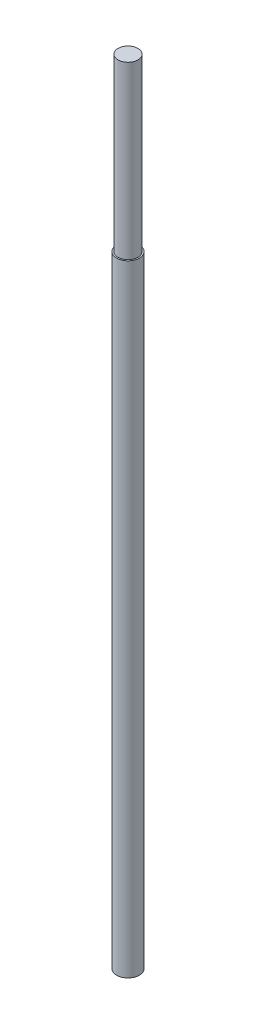
ISO-10303-21;
HEADER;
FILE_DESCRIPTION(('STEP AP214'),'2;1');
FILE_NAME('part.step','',(''),(''),'','','');
FILE_SCHEMA(('AUTOMOTIVE_DESIGN { 1 0 10303 214 1 1 1 1 }'));
ENDSEC;
DATA;
#1=APPLICATION_CONTEXT('core data for automotive mechanical design processes');
#2=APPLICATION_PROTOCOL_DEFINITION('international standard','automotive_design',2000,#1);
#3=PRODUCT_CONTEXT('',#1,'mechanical');
#4=PRODUCT('Part','Part','',(#3));
#5=PRODUCT_RELATED_PRODUCT_CATEGORY('part','',(#4));
#6=PRODUCT_DEFINITION_FORMATION('','',#4);
#7=PRODUCT_DEFINITION_CONTEXT('part definition',#1,'design');
#8=PRODUCT_DEFINITION('design','',#6,#7);
#9=PRODUCT_DEFINITION_SHAPE('','',#8);
#10=(LENGTH_UNIT() NAMED_UNIT(*) SI_UNIT(.MILLI.,.METRE.));
#11=(NAMED_UNIT(*) PLANE_ANGLE_UNIT() SI_UNIT($,.RADIAN.));
#12=(NAMED_UNIT(*) SI_UNIT($,.STERADIAN.) SOLID_ANGLE_UNIT());
#13=UNCERTAINTY_MEASURE_WITH_UNIT(LENGTH_MEASURE(1.E-05),#10,'distance_accuracy_value','');
#14=(GEOMETRIC_REPRESENTATION_CONTEXT(3) GLOBAL_UNCERTAINTY_ASSIGNED_CONTEXT((#13)) GLOBAL_UNIT_ASSIGNED_CONTEXT((#10,
#11,#12)) REPRESENTATION_CONTEXT('',''));
#15=CARTESIAN_POINT('',(0.,0.,0.));
#16=DIRECTION('',(0.,0.,1.));
#17=DIRECTION('',(1.,0.,0.));
#18=AXIS2_PLACEMENT_3D('',#15,#16,#17);
#19=CARTESIAN_POINT('',(0.,218.,0.));
#20=DIRECTION('',(0.,-1.,0.));
#21=DIRECTION('',(0.,0.,-1.));
#22=AXIS2_PLACEMENT_3D('',#19,#20,#21);
#23=CYLINDRICAL_SURFACE('',#22,4.);
#24=CARTESIAN_POINT('',(0.,218.,0.));
#25=DIRECTION('',(0.,1.,0.));
#26=DIRECTION('',(0.,0.,1.));
#27=AXIS2_PLACEMENT_3D('',#24,#25,#26);
#28=CIRCLE('',#27,4.);
#29=CARTESIAN_POINT('',(0.,218.,4.));
#30=VERTEX_POINT('',#29);
#31=EDGE_CURVE('E38',#30,#30,#28,.T.);
#32=ORIENTED_EDGE('',*,*,#31,.F.);
#33=EDGE_LOOP('',(#32));
#34=FACE_BOUND('',#33,.T.);
#35=CARTESIAN_POINT('',(0.,0.,0.));
#36=DIRECTION('',(0.,1.,0.));
#37=DIRECTION('',(0.,0.,1.));
#38=AXIS2_PLACEMENT_3D('',#35,#36,#37);
#39=CIRCLE('',#38,4.);
#40=CARTESIAN_POINT('',(0.,0.,4.));
#41=VERTEX_POINT('',#40);
#42=EDGE_CURVE('E34',#41,#41,#39,.T.);
#43=ORIENTED_EDGE('',*,*,#42,.T.);
#44=EDGE_LOOP('',(#43));
#45=FACE_BOUND('',#44,.T.);
#46=ADVANCED_FACE('F31',(#34,#45),#23,.T.);
#47=CARTESIAN_POINT('',(0.,218.,0.));
#48=DIRECTION('',(0.,1.,0.));
#49=DIRECTION('',(0.,0.,1.));
#50=AXIS2_PLACEMENT_3D('',#47,#48,#49);
#51=PLANE('',#50);
#52=CARTESIAN_POINT('',(0.,218.,0.));
#53=DIRECTION('',(0.,1.,0.));
#54=DIRECTION('',(0.,0.,1.));
#55=AXIS2_PLACEMENT_3D('',#52,#53,#54);
#56=CIRCLE('',#55,3.5);
#57=CARTESIAN_POINT('',(0.,218.,3.5));
#58=VERTEX_POINT('',#57);
#59=EDGE_CURVE('E10',#58,#58,#56,.T.);
#60=ORIENTED_EDGE('',*,*,#59,.F.);
#61=EDGE_LOOP('',(#60));
#62=FACE_BOUND('',#61,.T.);
#63=ORIENTED_EDGE('',*,*,#31,.T.);
#64=EDGE_LOOP('',(#63));
#65=FACE_BOUND('',#64,.T.);
#66=ADVANCED_FACE('F55',(#62,#65),#51,.T.);
#67=CARTESIAN_POINT('',(0.,0.,0.));
#68=DIRECTION('',(0.,1.,0.));
#69=DIRECTION('',(0.,0.,1.));
#70=AXIS2_PLACEMENT_3D('',#67,#68,#69);
#71=PLANE('',#70);
#72=ORIENTED_EDGE('',*,*,#42,.F.);
#73=EDGE_LOOP('',(#72));
#74=FACE_BOUND('',#73,.T.);
#75=ADVANCED_FACE('F52',(#74),#71,.F.);
#76=CARTESIAN_POINT('',(0.,278.,0.));
#77=DIRECTION('',(0.,-1.,0.));
#78=DIRECTION('',(0.,0.,-1.));
#79=AXIS2_PLACEMENT_3D('',#76,#77,#78);
#80=CYLINDRICAL_SURFACE('',#79,3.5);
#81=CARTESIAN_POINT('',(0.,278.,0.));
#82=DIRECTION('',(0.,1.,0.));
#83=DIRECTION('',(0.,0.,1.));
#84=AXIS2_PLACEMENT_3D('',#81,#82,#83);
#85=CIRCLE('',#84,3.5);
#86=CARTESIAN_POINT('',(0.,278.,3.5));
#87=VERTEX_POINT('',#86);
#88=EDGE_CURVE('E44',#87,#87,#85,.T.);
#89=ORIENTED_EDGE('',*,*,#88,.F.);
#90=EDGE_LOOP('',(#89));
#91=FACE_BOUND('',#90,.T.);
#92=ORIENTED_EDGE('',*,*,#59,.T.);
#93=EDGE_LOOP('',(#92));
#94=FACE_BOUND('',#93,.T.);
#95=ADVANCED_FACE('F54',(#91,#94),#80,.T.);
#96=CARTESIAN_POINT('',(0.,278.,0.));
#97=DIRECTION('',(0.,1.,0.));
#98=DIRECTION('',(0.,0.,1.));
#99=AXIS2_PLACEMENT_3D('',#96,#97,#98);
#100=PLANE('',#99);
#101=ORIENTED_EDGE('',*,*,#88,.T.);
#102=EDGE_LOOP('',(#101));
#103=FACE_BOUND('',#102,.T.);
#104=ADVANCED_FACE('F60',(#103),#100,.T.);
#105=CLOSED_SHELL('',(#46,#66,#75,#95,#104));
#106=MANIFOLD_SOLID_BREP('B2',#105);
#107=ADVANCED_BREP_SHAPE_REPRESENTATION('',(#18,#106),#14);
#108=SHAPE_DEFINITION_REPRESENTATION(#9,#107);
ENDSEC;
END-ISO-10303-21;
